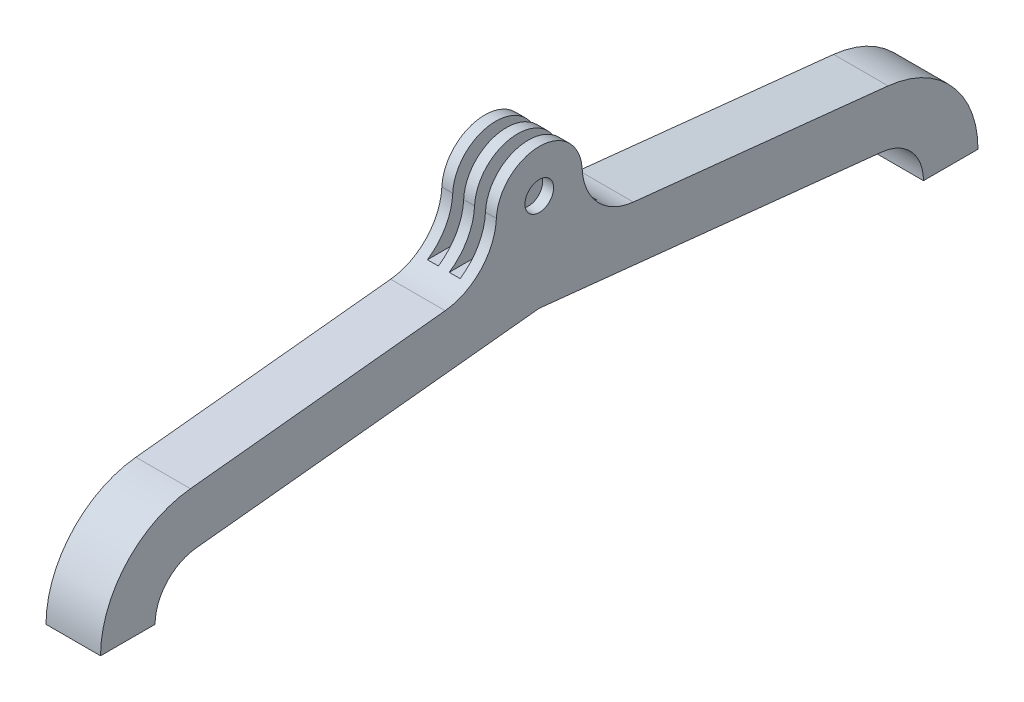
ISO-10303-21;
HEADER;
FILE_DESCRIPTION(('STEP AP214'),'2;1');
FILE_NAME('part.step','',(''),(''),'','','');
FILE_SCHEMA(('AUTOMOTIVE_DESIGN { 1 0 10303 214 1 1 1 1 }'));
ENDSEC;
DATA;
#1=APPLICATION_CONTEXT('core data for automotive mechanical design processes');
#2=APPLICATION_PROTOCOL_DEFINITION('international standard','automotive_design',2000,#1);
#3=PRODUCT_CONTEXT('',#1,'mechanical');
#4=PRODUCT('Part','Part','',(#3));
#5=PRODUCT_RELATED_PRODUCT_CATEGORY('part','',(#4));
#6=PRODUCT_DEFINITION_FORMATION('','',#4);
#7=PRODUCT_DEFINITION_CONTEXT('part definition',#1,'design');
#8=PRODUCT_DEFINITION('design','',#6,#7);
#9=PRODUCT_DEFINITION_SHAPE('','',#8);
#10=(LENGTH_UNIT() NAMED_UNIT(*) SI_UNIT(.MILLI.,.METRE.));
#11=(NAMED_UNIT(*) PLANE_ANGLE_UNIT() SI_UNIT($,.RADIAN.));
#12=(NAMED_UNIT(*) SI_UNIT($,.STERADIAN.) SOLID_ANGLE_UNIT());
#13=UNCERTAINTY_MEASURE_WITH_UNIT(LENGTH_MEASURE(1.E-05),#10,'distance_accuracy_value','');
#14=(GEOMETRIC_REPRESENTATION_CONTEXT(3) GLOBAL_UNCERTAINTY_ASSIGNED_CONTEXT((#13)) GLOBAL_UNIT_ASSIGNED_CONTEXT((#10,
#11,#12)) REPRESENTATION_CONTEXT('',''));
#15=CARTESIAN_POINT('',(0.,0.,0.));
#16=DIRECTION('',(0.,0.,1.));
#17=DIRECTION('',(1.,0.,0.));
#18=AXIS2_PLACEMENT_3D('',#15,#16,#17);
#19=CARTESIAN_POINT('',(-103.832838819891,125.,-287.5));
#20=DIRECTION('',(1.,0.,0.));
#21=DIRECTION('',(0.,0.,-1.));
#22=AXIS2_PLACEMENT_3D('',#19,#20,#21);
#23=CYLINDRICAL_SURFACE('',#22,9.99999999999998);
#24=CARTESIAN_POINT('',(3.81000000000001,125.,-287.5));
#25=DIRECTION('',(1.,0.,0.));
#26=DIRECTION('',(0.,0.,-1.));
#27=AXIS2_PLACEMENT_3D('',#24,#25,#26);
#28=CIRCLE('',#27,9.99999999999998);
#29=CARTESIAN_POINT('',(3.80999999999999,125.,-297.5));
#30=VERTEX_POINT('',#29);
#31=EDGE_CURVE('E235',#30,#30,#28,.F.);
#32=CARTESIAN_POINT('',(-3.80999999999999,125.,-287.5));
#33=DIRECTION('',(-1.,0.,0.));
#34=DIRECTION('',(0.,0.,1.));
#35=AXIS2_PLACEMENT_3D('',#32,#33,#34);
#36=CIRCLE('',#35,9.99999999999998);
#37=CARTESIAN_POINT('',(-3.80999999999999,125.,-297.5));
#38=VERTEX_POINT('',#37);
#39=EDGE_CURVE('E192',#38,#38,#36,.F.);
#40=CARTESIAN_POINT('',(3.80999999999999,125.,-297.5));
#41=CARTESIAN_POINT('',(3.73062499999999,125.,-297.5));
#42=CARTESIAN_POINT('',(3.65124999999999,125.,-297.5));
#43=CARTESIAN_POINT('',(3.49249999999999,125.,-297.5));
#44=CARTESIAN_POINT('',(3.41312499999999,125.,-297.5));
#45=CARTESIAN_POINT('',(3.25437499999999,125.,-297.5));
#46=CARTESIAN_POINT('',(3.17499999999999,125.,-297.5));
#47=CARTESIAN_POINT('',(3.01624999999999,125.,-297.5));
#48=CARTESIAN_POINT('',(2.936875,125.,-297.5));
#49=CARTESIAN_POINT('',(2.778125,125.,-297.5));
#50=CARTESIAN_POINT('',(2.69875,125.,-297.5));
#51=CARTESIAN_POINT('',(2.54,125.,-297.5));
#52=CARTESIAN_POINT('',(2.460625,125.,-297.5));
#53=CARTESIAN_POINT('',(2.301875,125.,-297.5));
#54=CARTESIAN_POINT('',(2.2225,125.,-297.5));
#55=CARTESIAN_POINT('',(2.06375,125.,-297.5));
#56=CARTESIAN_POINT('',(1.984375,125.,-297.5));
#57=CARTESIAN_POINT('',(1.825625,125.,-297.5));
#58=CARTESIAN_POINT('',(1.74625,125.,-297.5));
#59=CARTESIAN_POINT('',(1.5875,125.,-297.5));
#60=CARTESIAN_POINT('',(1.50812499999999,125.,-297.5));
#61=CARTESIAN_POINT('',(1.349375,125.,-297.5));
#62=CARTESIAN_POINT('',(1.27,125.,-297.5));
#63=CARTESIAN_POINT('',(1.11125,125.,-297.5));
#64=CARTESIAN_POINT('',(1.031875,125.,-297.5));
#65=CARTESIAN_POINT('',(0.873124999999998,125.,-297.5));
#66=CARTESIAN_POINT('',(0.793750000000001,125.,-297.5));
#67=CARTESIAN_POINT('',(0.635000000000001,125.,-297.5));
#68=CARTESIAN_POINT('',(0.555624999999999,125.,-297.5));
#69=CARTESIAN_POINT('',(0.396875,125.,-297.5));
#70=CARTESIAN_POINT('',(0.317500000000003,125.,-297.5));
#71=CARTESIAN_POINT('',(0.158750000000004,125.,-297.5));
#72=CARTESIAN_POINT('',(0.0793750000000019,125.,-297.5));
#73=CARTESIAN_POINT('',(-0.0793750000000019,125.,-297.5));
#74=CARTESIAN_POINT('',(-0.158750000000004,125.,-297.5));
#75=CARTESIAN_POINT('',(-0.317500000000003,125.,-297.5));
#76=CARTESIAN_POINT('',(-0.396875,125.,-297.5));
#77=CARTESIAN_POINT('',(-0.555624999999999,125.,-297.5));
#78=CARTESIAN_POINT('',(-0.635000000000001,125.,-297.5));
#79=CARTESIAN_POINT('',(-0.793750000000001,125.,-297.5));
#80=CARTESIAN_POINT('',(-0.873124999999998,125.,-297.5));
#81=CARTESIAN_POINT('',(-1.031875,125.,-297.5));
#82=CARTESIAN_POINT('',(-1.11125,125.,-297.5));
#83=CARTESIAN_POINT('',(-1.27,125.,-297.5));
#84=CARTESIAN_POINT('',(-1.349375,125.,-297.5));
#85=CARTESIAN_POINT('',(-1.50812499999999,125.,-297.5));
#86=CARTESIAN_POINT('',(-1.5875,125.,-297.5));
#87=CARTESIAN_POINT('',(-1.74625,125.,-297.5));
#88=CARTESIAN_POINT('',(-1.825625,125.,-297.5));
#89=CARTESIAN_POINT('',(-1.984375,125.,-297.5));
#90=CARTESIAN_POINT('',(-2.06375,125.,-297.5));
#91=CARTESIAN_POINT('',(-2.2225,125.,-297.5));
#92=CARTESIAN_POINT('',(-2.301875,125.,-297.5));
#93=CARTESIAN_POINT('',(-2.460625,125.,-297.5));
#94=CARTESIAN_POINT('',(-2.54,125.,-297.5));
#95=CARTESIAN_POINT('',(-2.69875,125.,-297.5));
#96=CARTESIAN_POINT('',(-2.778125,125.,-297.5));
#97=CARTESIAN_POINT('',(-2.936875,125.,-297.5));
#98=CARTESIAN_POINT('',(-3.01624999999999,125.,-297.5));
#99=CARTESIAN_POINT('',(-3.17499999999999,125.,-297.5));
#100=CARTESIAN_POINT('',(-3.25437499999999,125.,-297.5));
#101=CARTESIAN_POINT('',(-3.41312499999999,125.,-297.5));
#102=CARTESIAN_POINT('',(-3.49249999999999,125.,-297.5));
#103=CARTESIAN_POINT('',(-3.65124999999999,125.,-297.5));
#104=CARTESIAN_POINT('',(-3.73062499999999,125.,-297.5));
#105=CARTESIAN_POINT('',(-3.80999999999999,125.,-297.5));
#106=B_SPLINE_CURVE_WITH_KNOTS('',3,(#40,#41,#42,#43,#44,#45,#46,#47,#48,#49,#50,#51,#52,#53,
#54,#55,#56,#57,#58,#59,#60,#61,#62,#63,#64,#65,#66,#67,#68,#69,#70,#71,#72,#73,#74,#75,#76,#77,
#78,#79,#80,#81,#82,#83,#84,#85,#86,#87,#88,#89,#90,#91,#92,#93,#94,#95,#96,#97,#98,#99,#100,
#101,#102,#103,#104,#105),.UNSPECIFIED.,.F.,.F.,(4,2,2,2,2,2,2,2,2,2,2,2,2,2,2,2,2,2,2,2,2,2,2,
2,2,2,2,2,2,2,2,2,4),(0.,0.238125000000006,0.476249999999998,0.714375000000003,
0.952499999999995,1.190625,1.42874999999999,1.666875,1.90499999999999,2.143125,2.38125,
2.61937499999999,2.8575,3.09562499999999,3.33375,3.57187499999999,3.80999999999999,4.048125,
4.28624999999999,4.524375,4.76249999999999,5.00062499999999,5.23874999999999,5.47687499999999,
5.715,5.95312499999999,6.19125,6.42937499999999,6.66749999999999,6.90562499999998,
7.14374999999999,7.38187499999998,7.61999999999999),.UNSPECIFIED.);
#107=EDGE_CURVE('BSEAM38',#30,#38,#106,.T.);
#108=ORIENTED_EDGE('',*,*,#31,.F.);
#109=ORIENTED_EDGE('',*,*,#39,.F.);
#110=ORIENTED_EDGE('',*,*,#107,.T.);
#111=ORIENTED_EDGE('',*,*,#107,.F.);
#112=EDGE_LOOP('',(#108,#110,#109,#111));
#113=FACE_BOUND('',#112,.T.);
#114=ADVANCED_FACE('F38',(#113),#23,.F.);
#115=CARTESIAN_POINT('',(-103.832838819891,125.,-287.5));
#116=DIRECTION('',(1.,0.,0.));
#117=DIRECTION('',(0.,0.,-1.));
#118=AXIS2_PLACEMENT_3D('',#115,#116,#117);
#119=CYLINDRICAL_SURFACE('',#118,30.);
#120=DIRECTION('',(1.,0.,0.));
#121=VECTOR('',#120,1.);
#122=CARTESIAN_POINT('',(-103.832838819891,126.383586201256,-317.468077836653));
#123=LINE('',#122,#121);
#124=CARTESIAN_POINT('',(3.81000000000001,126.383586201256,-317.468077836653));
#125=VERTEX_POINT('',#124);
#126=CARTESIAN_POINT('',(-3.80999999999999,126.383586201256,-317.468077836653));
#127=VERTEX_POINT('',#126);
#128=EDGE_CURVE('E344',#125,#127,#123,.F.);
#129=ORIENTED_EDGE('',*,*,#128,.T.);
#130=CARTESIAN_POINT('',(-3.80999999999999,125.,-287.5));
#131=DIRECTION('',(-1.,0.,0.));
#132=DIRECTION('',(0.,0.,1.));
#133=AXIS2_PLACEMENT_3D('',#130,#131,#132);
#134=CIRCLE('',#133,30.);
#135=CARTESIAN_POINT('',(-3.80999999999999,126.383586201256,-257.531922163347));
#136=VERTEX_POINT('',#135);
#137=EDGE_CURVE('E187',#127,#136,#134,.F.);
#138=ORIENTED_EDGE('',*,*,#137,.T.);
#139=DIRECTION('',(1.,0.,0.));
#140=VECTOR('',#139,1.);
#141=CARTESIAN_POINT('',(-103.832838819891,126.383586201256,-257.531922163347));
#142=LINE('',#141,#140);
#143=CARTESIAN_POINT('',(3.81000000000001,126.383586201256,-257.531922163347));
#144=VERTEX_POINT('',#143);
#145=EDGE_CURVE('E339',#136,#144,#142,.T.);
#146=ORIENTED_EDGE('',*,*,#145,.T.);
#147=CARTESIAN_POINT('',(3.81000000000001,125.,-287.5));
#148=DIRECTION('',(1.,0.,0.));
#149=DIRECTION('',(0.,0.,-1.));
#150=AXIS2_PLACEMENT_3D('',#147,#148,#149);
#151=CIRCLE('',#150,30.);
#152=EDGE_CURVE('E230',#144,#125,#151,.F.);
#153=ORIENTED_EDGE('',*,*,#152,.T.);
#154=EDGE_LOOP('',(#129,#138,#146,#153));
#155=FACE_BOUND('',#154,.T.);
#156=ADVANCED_FACE('F437',(#155),#119,.T.);
#157=CARTESIAN_POINT('',(-11.43,125.,-287.5));
#158=DIRECTION('',(-1.,0.,0.));
#159=DIRECTION('',(0.,0.,1.));
#160=AXIS2_PLACEMENT_3D('',#157,#158,#159);
#161=CIRCLE('',#160,30.);
#162=CARTESIAN_POINT('',(-11.43,126.383586201256,-317.468077836653));
#163=VERTEX_POINT('',#162);
#164=CARTESIAN_POINT('',(-11.43,126.383586201256,-257.531922163347));
#165=VERTEX_POINT('',#164);
#166=EDGE_CURVE('E204',#163,#165,#161,.F.);
#167=ORIENTED_EDGE('',*,*,#166,.F.);
#168=CARTESIAN_POINT('',(-19.05,126.383586201256,-317.468077836653));
#169=VERTEX_POINT('',#168);
#170=EDGE_CURVE('E338',#163,#169,#123,.F.);
#171=ORIENTED_EDGE('',*,*,#170,.T.);
#172=CARTESIAN_POINT('',(-19.05,125.,-287.5));
#173=DIRECTION('',(1.,0.,0.));
#174=DIRECTION('',(0.,0.,-1.));
#175=AXIS2_PLACEMENT_3D('',#172,#173,#174);
#176=CIRCLE('',#175,30.);
#177=CARTESIAN_POINT('',(-19.05,126.383586201256,-257.531922163347));
#178=VERTEX_POINT('',#177);
#179=EDGE_CURVE('E242',#178,#169,#176,.F.);
#180=ORIENTED_EDGE('',*,*,#179,.F.);
#181=EDGE_CURVE('E335',#178,#165,#142,.T.);
#182=ORIENTED_EDGE('',*,*,#181,.T.);
#183=EDGE_LOOP('',(#167,#171,#180,#182));
#184=FACE_BOUND('',#183,.T.);
#185=ADVANCED_FACE('F368',(#184),#119,.T.);
#186=CARTESIAN_POINT('',(-103.832838819891,128.228367802931,-357.42551495219));
#187=DIRECTION('',(1.,0.,0.));
#188=DIRECTION('',(0.,0.,-1.));
#189=AXIS2_PLACEMENT_3D('',#186,#187,#188);
#190=CYLINDRICAL_SURFACE('',#189,40.);
#191=CARTESIAN_POINT('',(-3.80999999999999,128.228367802931,-357.42551495219));
#192=DIRECTION('',(-1.,0.,0.));
#193=DIRECTION('',(0.,0.,1.));
#194=AXIS2_PLACEMENT_3D('',#191,#192,#193);
#195=CIRCLE('',#194,40.);
#196=CARTESIAN_POINT('',(-3.80999999999999,95.0000000000001,-335.157251141262));
#197=VERTEX_POINT('',#196);
#198=EDGE_CURVE('E181',#127,#197,#195,.F.);
#199=ORIENTED_EDGE('',*,*,#198,.F.);
#200=ORIENTED_EDGE('',*,*,#128,.F.);
#201=CARTESIAN_POINT('',(3.81000000000001,128.228367802931,-357.42551495219));
#202=DIRECTION('',(1.,0.,0.));
#203=DIRECTION('',(0.,0.,-1.));
#204=AXIS2_PLACEMENT_3D('',#201,#202,#203);
#205=CIRCLE('',#204,40.);
#206=CARTESIAN_POINT('',(3.81000000000001,95.0000000000001,-335.157251141262));
#207=VERTEX_POINT('',#206);
#208=EDGE_CURVE('E232',#207,#125,#205,.F.);
#209=ORIENTED_EDGE('',*,*,#208,.F.);
#210=DIRECTION('',(1.,0.,0.));
#211=VECTOR('',#210,1.);
#212=CARTESIAN_POINT('',(-103.832838819891,95.0000000000001,-335.157251141262));
#213=LINE('',#212,#211);
#214=CARTESIAN_POINT('',(11.43,95.0000000000001,-335.157251141262));
#215=VERTEX_POINT('',#214);
#216=EDGE_CURVE('E220',#215,#207,#213,.F.);
#217=ORIENTED_EDGE('',*,*,#216,.F.);
#218=CARTESIAN_POINT('',(11.43,128.228367802931,-357.42551495219));
#219=DIRECTION('',(1.,0.,0.));
#220=DIRECTION('',(0.,0.,-1.));
#221=AXIS2_PLACEMENT_3D('',#218,#219,#220);
#222=CIRCLE('',#221,40.);
#223=CARTESIAN_POINT('',(11.43,126.383586201256,-317.468077836653));
#224=VERTEX_POINT('',#223);
#225=EDGE_CURVE('E224',#215,#224,#222,.F.);
#226=ORIENTED_EDGE('',*,*,#225,.T.);
#227=CARTESIAN_POINT('',(19.05,126.383586201256,-317.468077836653));
#228=VERTEX_POINT('',#227);
#229=EDGE_CURVE('E340',#228,#224,#123,.F.);
#230=ORIENTED_EDGE('',*,*,#229,.F.);
#231=CARTESIAN_POINT('',(19.05,128.228367802931,-357.42551495219));
#232=DIRECTION('',(-1.,0.,0.));
#233=DIRECTION('',(0.,0.,1.));
#234=AXIS2_PLACEMENT_3D('',#231,#232,#233);
#235=CIRCLE('',#234,40.);
#236=CARTESIAN_POINT('',(19.05,88.4473252064938,-353.245963547981));
#237=VERTEX_POINT('',#236);
#238=EDGE_CURVE('E346',#237,#228,#235,.T.);
#239=ORIENTED_EDGE('',*,*,#238,.F.);
#240=DIRECTION('',(1.,0.,0.));
#241=VECTOR('',#240,1.);
#242=CARTESIAN_POINT('',(-19.05,88.4473252064938,-353.245963547981));
#243=LINE('',#242,#241);
#244=CARTESIAN_POINT('',(-19.05,88.4473252064938,-353.245963547981));
#245=VERTEX_POINT('',#244);
#246=EDGE_CURVE('E331',#245,#237,#243,.T.);
#247=ORIENTED_EDGE('',*,*,#246,.F.);
#248=CARTESIAN_POINT('',(-19.05,128.228367802931,-357.42551495219));
#249=DIRECTION('',(1.,0.,0.));
#250=DIRECTION('',(0.,0.,-1.));
#251=AXIS2_PLACEMENT_3D('',#248,#249,#250);
#252=CIRCLE('',#251,40.);
#253=EDGE_CURVE('E348',#169,#245,#252,.T.);
#254=ORIENTED_EDGE('',*,*,#253,.F.);
#255=ORIENTED_EDGE('',*,*,#170,.F.);
#256=CARTESIAN_POINT('',(-11.43,128.228367802931,-357.42551495219));
#257=DIRECTION('',(-1.,0.,0.));
#258=DIRECTION('',(0.,0.,1.));
#259=AXIS2_PLACEMENT_3D('',#256,#257,#258);
#260=CIRCLE('',#259,40.);
#261=CARTESIAN_POINT('',(-11.43,95.0000000000001,-335.157251141262));
#262=VERTEX_POINT('',#261);
#263=EDGE_CURVE('E203',#163,#262,#260,.F.);
#264=ORIENTED_EDGE('',*,*,#263,.T.);
#265=DIRECTION('',(1.,0.,0.));
#266=VECTOR('',#265,1.);
#267=CARTESIAN_POINT('',(-103.832838819891,95.0000000000001,-335.157251141262));
#268=LINE('',#267,#266);
#269=EDGE_CURVE('E195',#197,#262,#268,.F.);
#270=ORIENTED_EDGE('',*,*,#269,.F.);
#271=EDGE_LOOP('',(#199,#200,#209,#217,#226,#230,#239,#247,#254,#255,#264,#270));
#272=FACE_BOUND('',#271,.T.);
#273=ADVANCED_FACE('F200',(#272),#190,.F.);
#274=CARTESIAN_POINT('',(-103.832838819891,128.228367802931,-217.57448504781));
#275=DIRECTION('',(1.,0.,0.));
#276=DIRECTION('',(0.,0.,-1.));
#277=AXIS2_PLACEMENT_3D('',#274,#275,#276);
#278=CYLINDRICAL_SURFACE('',#277,40.);
#279=CARTESIAN_POINT('',(-3.80999999999999,128.228367802931,-217.57448504781));
#280=DIRECTION('',(-1.,0.,0.));
#281=DIRECTION('',(0.,0.,1.));
#282=AXIS2_PLACEMENT_3D('',#279,#280,#281);
#283=CIRCLE('',#282,40.);
#284=CARTESIAN_POINT('',(-3.80999999999999,95.0000000000001,-239.842748858738));
#285=VERTEX_POINT('',#284);
#286=EDGE_CURVE('E12',#285,#136,#283,.F.);
#287=ORIENTED_EDGE('',*,*,#286,.F.);
#288=DIRECTION('',(1.,0.,0.));
#289=VECTOR('',#288,1.);
#290=CARTESIAN_POINT('',(-103.832838819891,95.0000000000001,-239.842748858738));
#291=LINE('',#290,#289);
#292=CARTESIAN_POINT('',(-11.43,95.0000000000001,-239.842748858738));
#293=VERTEX_POINT('',#292);
#294=EDGE_CURVE('E197',#293,#285,#291,.T.);
#295=ORIENTED_EDGE('',*,*,#294,.F.);
#296=CARTESIAN_POINT('',(-11.43,128.228367802931,-217.57448504781));
#297=DIRECTION('',(-1.,0.,0.));
#298=DIRECTION('',(0.,0.,1.));
#299=AXIS2_PLACEMENT_3D('',#296,#297,#298);
#300=CIRCLE('',#299,40.);
#301=EDGE_CURVE('E46',#293,#165,#300,.F.);
#302=ORIENTED_EDGE('',*,*,#301,.T.);
#303=ORIENTED_EDGE('',*,*,#181,.F.);
#304=CARTESIAN_POINT('',(-19.05,128.228367802931,-217.57448504781));
#305=DIRECTION('',(1.,0.,0.));
#306=DIRECTION('',(0.,0.,-1.));
#307=AXIS2_PLACEMENT_3D('',#304,#305,#306);
#308=CIRCLE('',#307,40.);
#309=CARTESIAN_POINT('',(-19.05,88.4473252064938,-221.754036452019));
#310=VERTEX_POINT('',#309);
#311=EDGE_CURVE('E352',#310,#178,#308,.T.);
#312=ORIENTED_EDGE('',*,*,#311,.F.);
#313=DIRECTION('',(-1.,0.,0.));
#314=VECTOR('',#313,1.);
#315=CARTESIAN_POINT('',(-19.05,88.4473252064938,-221.754036452019));
#316=LINE('',#315,#314);
#317=CARTESIAN_POINT('',(19.05,88.4473252064938,-221.754036452019));
#318=VERTEX_POINT('',#317);
#319=EDGE_CURVE('E343',#318,#310,#316,.T.);
#320=ORIENTED_EDGE('',*,*,#319,.F.);
#321=CARTESIAN_POINT('',(19.05,128.228367802931,-217.57448504781));
#322=DIRECTION('',(-1.,0.,0.));
#323=DIRECTION('',(0.,0.,1.));
#324=AXIS2_PLACEMENT_3D('',#321,#322,#323);
#325=CIRCLE('',#324,40.);
#326=CARTESIAN_POINT('',(19.05,126.383586201256,-257.531922163347));
#327=VERTEX_POINT('',#326);
#328=EDGE_CURVE('E350',#327,#318,#325,.T.);
#329=ORIENTED_EDGE('',*,*,#328,.F.);
#330=CARTESIAN_POINT('',(11.43,126.383586201256,-257.531922163347));
#331=VERTEX_POINT('',#330);
#332=EDGE_CURVE('E334',#331,#327,#142,.T.);
#333=ORIENTED_EDGE('',*,*,#332,.F.);
#334=CARTESIAN_POINT('',(11.43,128.228367802931,-217.57448504781));
#335=DIRECTION('',(1.,0.,0.));
#336=DIRECTION('',(0.,0.,-1.));
#337=AXIS2_PLACEMENT_3D('',#334,#335,#336);
#338=CIRCLE('',#337,40.);
#339=CARTESIAN_POINT('',(11.43,95.0000000000001,-239.842748858738));
#340=VERTEX_POINT('',#339);
#341=EDGE_CURVE('E356',#331,#340,#338,.F.);
#342=ORIENTED_EDGE('',*,*,#341,.T.);
#343=DIRECTION('',(1.,0.,0.));
#344=VECTOR('',#343,1.);
#345=CARTESIAN_POINT('',(-103.832838819891,95.0000000000001,-239.842748858738));
#346=LINE('',#345,#344);
#347=CARTESIAN_POINT('',(3.81000000000001,95.0000000000001,-239.842748858738));
#348=VERTEX_POINT('',#347);
#349=EDGE_CURVE('E354',#348,#340,#346,.T.);
#350=ORIENTED_EDGE('',*,*,#349,.F.);
#351=CARTESIAN_POINT('',(3.81000000000001,128.228367802931,-217.57448504781));
#352=DIRECTION('',(1.,0.,0.));
#353=DIRECTION('',(0.,0.,-1.));
#354=AXIS2_PLACEMENT_3D('',#351,#352,#353);
#355=CIRCLE('',#354,40.);
#356=EDGE_CURVE('E359',#144,#348,#355,.F.);
#357=ORIENTED_EDGE('',*,*,#356,.F.);
#358=ORIENTED_EDGE('',*,*,#145,.F.);
#359=EDGE_LOOP('',(#287,#295,#302,#303,#312,#320,#329,#333,#342,#350,#357,#358));
#360=FACE_BOUND('',#359,.T.);
#361=ADVANCED_FACE('F40',(#360),#278,.F.);
#362=CARTESIAN_POINT('',(-11.43,125.,-287.5));
#363=DIRECTION('',(-1.,0.,0.));
#364=DIRECTION('',(0.,0.,1.));
#365=AXIS2_PLACEMENT_3D('',#362,#363,#364);
#366=CIRCLE('',#365,9.99999999999998);
#367=CARTESIAN_POINT('',(-11.43,125.,-277.5));
#368=VERTEX_POINT('',#367);
#369=EDGE_CURVE('E210',#368,#368,#366,.F.);
#370=ORIENTED_EDGE('',*,*,#369,.T.);
#371=EDGE_LOOP('',(#370));
#372=FACE_BOUND('',#371,.T.);
#373=CARTESIAN_POINT('',(-19.05,125.,-287.5));
#374=DIRECTION('',(1.,0.,0.));
#375=DIRECTION('',(0.,0.,-1.));
#376=AXIS2_PLACEMENT_3D('',#373,#374,#375);
#377=CIRCLE('',#376,9.99999999999998);
#378=CARTESIAN_POINT('',(-19.05,125.,-297.5));
#379=VERTEX_POINT('',#378);
#380=EDGE_CURVE('E238',#379,#379,#377,.F.);
#381=ORIENTED_EDGE('',*,*,#380,.T.);
#382=EDGE_LOOP('',(#381));
#383=FACE_BOUND('',#382,.T.);
#384=ADVANCED_FACE('F446',(#372,#383),#23,.F.);
#385=CARTESIAN_POINT('',(11.43,125.,-287.5));
#386=DIRECTION('',(1.,0.,0.));
#387=DIRECTION('',(0.,0.,-1.));
#388=AXIS2_PLACEMENT_3D('',#385,#386,#387);
#389=CIRCLE('',#388,30.);
#390=EDGE_CURVE('E222',#331,#224,#389,.F.);
#391=ORIENTED_EDGE('',*,*,#390,.F.);
#392=ORIENTED_EDGE('',*,*,#332,.T.);
#393=CARTESIAN_POINT('',(19.05,125.,-287.5));
#394=DIRECTION('',(1.,0.,0.));
#395=DIRECTION('',(0.,0.,-1.));
#396=AXIS2_PLACEMENT_3D('',#393,#394,#395);
#397=CIRCLE('',#396,30.);
#398=EDGE_CURVE('E239',#228,#327,#397,.T.);
#399=ORIENTED_EDGE('',*,*,#398,.F.);
#400=ORIENTED_EDGE('',*,*,#229,.T.);
#401=EDGE_LOOP('',(#391,#392,#399,#400));
#402=FACE_BOUND('',#401,.T.);
#403=ADVANCED_FACE('F421',(#402),#119,.T.);
#404=CARTESIAN_POINT('',(0.,0.,-523.920393549917));
#405=DIRECTION('',(-1.,0.,0.));
#406=DIRECTION('',(0.,0.,1.));
#407=AXIS2_PLACEMENT_3D('',#404,#405,#406);
#408=CYLINDRICAL_SURFACE('',#407,32.0296064500826);
#409=DIRECTION('',(-1.,0.,0.));
#410=VECTOR('',#409,1.);
#411=CARTESIAN_POINT('',(-19.05,31.8542784634466,-527.267128215285));
#412=LINE('',#411,#410);
#413=CARTESIAN_POINT('',(19.05,31.8542784634466,-527.267128215285));
#414=VERTEX_POINT('',#413);
#415=CARTESIAN_POINT('',(-19.05,31.8542784634466,-527.267128215285));
#416=VERTEX_POINT('',#415);
#417=EDGE_CURVE('E251',#414,#416,#412,.T.);
#418=ORIENTED_EDGE('',*,*,#417,.T.);
#419=CARTESIAN_POINT('',(-19.05,0.,-523.920393549917));
#420=DIRECTION('',(-1.,0.,0.));
#421=DIRECTION('',(0.,0.,1.));
#422=AXIS2_PLACEMENT_3D('',#419,#420,#421);
#423=CIRCLE('',#422,32.0296064500826);
#424=CARTESIAN_POINT('',(-19.05,0.,-555.95));
#425=VERTEX_POINT('',#424);
#426=EDGE_CURVE('E322',#416,#425,#423,.T.);
#427=ORIENTED_EDGE('',*,*,#426,.T.);
#428=DIRECTION('',(-1.,0.,0.));
#429=VECTOR('',#428,1.);
#430=CARTESIAN_POINT('',(-19.05,0.,-555.95));
#431=LINE('',#430,#429);
#432=CARTESIAN_POINT('',(19.05,0.,-555.95));
#433=VERTEX_POINT('',#432);
#434=EDGE_CURVE('E313',#433,#425,#431,.T.);
#435=ORIENTED_EDGE('',*,*,#434,.F.);
#436=CARTESIAN_POINT('',(19.05,0.,-523.920393549917));
#437=DIRECTION('',(-1.,0.,0.));
#438=DIRECTION('',(0.,0.,1.));
#439=AXIS2_PLACEMENT_3D('',#436,#437,#438);
#440=CIRCLE('',#439,32.0296064500826);
#441=EDGE_CURVE('E325',#414,#433,#440,.T.);
#442=ORIENTED_EDGE('',*,*,#441,.F.);
#443=EDGE_LOOP('',(#418,#427,#435,#442));
#444=FACE_BOUND('',#443,.T.);
#445=ADVANCED_FACE('F391',(#444),#408,.F.);
#446=CARTESIAN_POINT('',(0.,0.,-523.920393549917));
#447=DIRECTION('',(-1.,0.,0.));
#448=DIRECTION('',(0.,0.,1.));
#449=AXIS2_PLACEMENT_3D('',#446,#447,#448);
#450=CYLINDRICAL_SURFACE('',#449,70.1296064500826);
#451=DIRECTION('',(1.,0.,0.));
#452=VECTOR('',#451,1.);
#453=CARTESIAN_POINT('',(-19.05,69.7457215365534,-531.248150927794));
#454=LINE('',#453,#452);
#455=CARTESIAN_POINT('',(-19.05,69.7457215365534,-531.248150927794));
#456=VERTEX_POINT('',#455);
#457=CARTESIAN_POINT('',(19.05,69.7457215365534,-531.248150927794));
#458=VERTEX_POINT('',#457);
#459=EDGE_CURVE('E254',#456,#458,#454,.T.);
#460=ORIENTED_EDGE('',*,*,#459,.T.);
#461=CARTESIAN_POINT('',(19.05,0.,-523.920393549917));
#462=DIRECTION('',(-1.,0.,0.));
#463=DIRECTION('',(0.,0.,1.));
#464=AXIS2_PLACEMENT_3D('',#461,#462,#463);
#465=CIRCLE('',#464,70.1296064500826);
#466=CARTESIAN_POINT('',(19.05,-1.11022302462516E-13,-594.05));
#467=VERTEX_POINT('',#466);
#468=EDGE_CURVE('E328',#458,#467,#465,.T.);
#469=ORIENTED_EDGE('',*,*,#468,.T.);
#470=DIRECTION('',(1.,0.,0.));
#471=VECTOR('',#470,1.);
#472=CARTESIAN_POINT('',(-19.05,-1.11022302462516E-13,-594.05));
#473=LINE('',#472,#471);
#474=CARTESIAN_POINT('',(-19.05,-1.11022302462516E-13,-594.05));
#475=VERTEX_POINT('',#474);
#476=EDGE_CURVE('E258',#475,#467,#473,.T.);
#477=ORIENTED_EDGE('',*,*,#476,.F.);
#478=CARTESIAN_POINT('',(-19.05,0.,-523.920393549917));
#479=DIRECTION('',(-1.,0.,0.));
#480=DIRECTION('',(0.,0.,1.));
#481=AXIS2_PLACEMENT_3D('',#478,#479,#480);
#482=CIRCLE('',#481,70.1296064500826);
#483=EDGE_CURVE('E319',#456,#475,#482,.T.);
#484=ORIENTED_EDGE('',*,*,#483,.F.);
#485=EDGE_LOOP('',(#460,#469,#477,#484));
#486=FACE_BOUND('',#485,.T.);
#487=ADVANCED_FACE('F387',(#486),#450,.T.);
#488=CARTESIAN_POINT('',(-19.05,95.354852418781,-287.5));
#489=DIRECTION('',(0.,-0.994526064910937,0.104488785105228));
#490=DIRECTION('',(0.,-0.104488785105228,-0.994526064910937));
#491=AXIS2_PLACEMENT_3D('',#488,#489,#490);
#492=PLANE('',#491);
#493=DIRECTION('',(0.,-0.104488785105228,-0.994526064910937));
#494=VECTOR('',#493,1.);
#495=CARTESIAN_POINT('',(-19.05,95.354852418781,-287.5));
#496=LINE('',#495,#494);
#497=EDGE_CURVE('E262',#245,#456,#496,.T.);
#498=ORIENTED_EDGE('',*,*,#497,.F.);
#499=ORIENTED_EDGE('',*,*,#246,.T.);
#500=DIRECTION('',(0.,-0.104488785105228,-0.994526064910937));
#501=VECTOR('',#500,1.);
#502=CARTESIAN_POINT('',(19.05,95.354852418781,-287.5));
#503=LINE('',#502,#501);
#504=EDGE_CURVE('E255',#237,#458,#503,.T.);
#505=ORIENTED_EDGE('',*,*,#504,.T.);
#506=ORIENTED_EDGE('',*,*,#459,.F.);
#507=EDGE_LOOP('',(#498,#499,#505,#506));
#508=FACE_BOUND('',#507,.T.);
#509=ADVANCED_FACE('F378',(#508),#492,.F.);
#510=CARTESIAN_POINT('',(-19.05,57.045147581219,-287.5));
#511=DIRECTION('',(0.,0.994526064910937,-0.104488785105228));
#512=DIRECTION('',(0.,0.104488785105228,0.994526064910937));
#513=AXIS2_PLACEMENT_3D('',#510,#511,#512);
#514=PLANE('',#513);
#515=ORIENTED_EDGE('',*,*,#417,.F.);
#516=DIRECTION('',(0.,-0.104488785105228,-0.994526064910937));
#517=VECTOR('',#516,1.);
#518=CARTESIAN_POINT('',(19.05,57.045147581219,-287.5));
#519=LINE('',#518,#517);
#520=CARTESIAN_POINT('',(19.05,57.045147581219,-287.5));
#521=VERTEX_POINT('',#520);
#522=EDGE_CURVE('E304',#521,#414,#519,.T.);
#523=ORIENTED_EDGE('',*,*,#522,.F.);
#524=DIRECTION('',(1.,0.,0.));
#525=VECTOR('',#524,1.);
#526=CARTESIAN_POINT('',(-19.05,57.045147581219,-287.5));
#527=LINE('',#526,#525);
#528=CARTESIAN_POINT('',(-19.05,57.045147581219,-287.5));
#529=VERTEX_POINT('',#528);
#530=EDGE_CURVE('E259',#529,#521,#527,.T.);
#531=ORIENTED_EDGE('',*,*,#530,.F.);
#532=DIRECTION('',(0.,-0.104488785105228,-0.994526064910937));
#533=VECTOR('',#532,1.);
#534=CARTESIAN_POINT('',(-19.05,57.045147581219,-287.5));
#535=LINE('',#534,#533);
#536=EDGE_CURVE('E301',#529,#416,#535,.T.);
#537=ORIENTED_EDGE('',*,*,#536,.T.);
#538=EDGE_LOOP('',(#515,#523,#531,#537));
#539=FACE_BOUND('',#538,.T.);
#540=ADVANCED_FACE('F395',(#539),#514,.F.);
#541=CARTESIAN_POINT('',(-19.05,31.8542784634466,-47.7328717847149));
#542=DIRECTION('',(0.,-0.994526064910937,-0.104488785105228));
#543=DIRECTION('',(0.,0.104488785105228,-0.994526064910937));
#544=AXIS2_PLACEMENT_3D('',#541,#542,#543);
#545=PLANE('',#544);
#546=DIRECTION('',(0.,0.104488785105228,-0.994526064910937));
#547=VECTOR('',#546,1.);
#548=CARTESIAN_POINT('',(-19.05,31.8542784634466,-47.7328717847149));
#549=LINE('',#548,#547);
#550=CARTESIAN_POINT('',(-19.05,31.8542784634466,-47.7328717847149));
#551=VERTEX_POINT('',#550);
#552=EDGE_CURVE('E289',#551,#529,#549,.T.);
#553=ORIENTED_EDGE('',*,*,#552,.T.);
#554=ORIENTED_EDGE('',*,*,#530,.T.);
#555=DIRECTION('',(0.,0.104488785105228,-0.994526064910937));
#556=VECTOR('',#555,1.);
#557=CARTESIAN_POINT('',(19.05,31.8542784634466,-47.7328717847149));
#558=LINE('',#557,#556);
#559=CARTESIAN_POINT('',(19.05,31.8542784634466,-47.7328717847149));
#560=VERTEX_POINT('',#559);
#561=EDGE_CURVE('E292',#560,#521,#558,.T.);
#562=ORIENTED_EDGE('',*,*,#561,.F.);
#563=DIRECTION('',(-1.,0.,0.));
#564=VECTOR('',#563,1.);
#565=CARTESIAN_POINT('',(-19.05,31.8542784634466,-47.7328717847149));
#566=LINE('',#565,#564);
#567=EDGE_CURVE('E278',#560,#551,#566,.T.);
#568=ORIENTED_EDGE('',*,*,#567,.T.);
#569=EDGE_LOOP('',(#553,#554,#562,#568));
#570=FACE_BOUND('',#569,.T.);
#571=ADVANCED_FACE('F399',(#570),#545,.T.);
#572=CARTESIAN_POINT('',(-19.05,69.7457215365533,-43.7518490722057));
#573=DIRECTION('',(0.,0.994526064910937,0.104488785105228));
#574=DIRECTION('',(0.,-0.104488785105228,0.994526064910937));
#575=AXIS2_PLACEMENT_3D('',#572,#573,#574);
#576=PLANE('',#575);
#577=DIRECTION('',(0.,0.104488785105228,-0.994526064910937));
#578=VECTOR('',#577,1.);
#579=CARTESIAN_POINT('',(19.05,69.7457215365533,-43.7518490722057));
#580=LINE('',#579,#578);
#581=CARTESIAN_POINT('',(19.05,69.7457215365533,-43.7518490722057));
#582=VERTEX_POINT('',#581);
#583=EDGE_CURVE('E295',#582,#318,#580,.T.);
#584=ORIENTED_EDGE('',*,*,#583,.T.);
#585=ORIENTED_EDGE('',*,*,#319,.T.);
#586=DIRECTION('',(0.,0.104488785105228,-0.994526064910937));
#587=VECTOR('',#586,1.);
#588=CARTESIAN_POINT('',(-19.05,69.7457215365533,-43.7518490722057));
#589=LINE('',#588,#587);
#590=CARTESIAN_POINT('',(-19.05,69.7457215365533,-43.7518490722057));
#591=VERTEX_POINT('',#590);
#592=EDGE_CURVE('E263',#591,#310,#589,.T.);
#593=ORIENTED_EDGE('',*,*,#592,.F.);
#594=DIRECTION('',(1.,0.,0.));
#595=VECTOR('',#594,1.);
#596=CARTESIAN_POINT('',(-19.05,69.7457215365533,-43.7518490722057));
#597=LINE('',#596,#595);
#598=EDGE_CURVE('E275',#591,#582,#597,.T.);
#599=ORIENTED_EDGE('',*,*,#598,.T.);
#600=EDGE_LOOP('',(#584,#585,#593,#599));
#601=FACE_BOUND('',#600,.T.);
#602=ADVANCED_FACE('F415',(#601),#576,.T.);
#603=CARTESIAN_POINT('',(-19.05,69.7457215365533,-43.7518490722057));
#604=DIRECTION('',(1.,0.,0.));
#605=DIRECTION('',(0.,0.,-1.));
#606=AXIS2_PLACEMENT_3D('',#603,#604,#605);
#607=PLANE('',#606);
#608=ORIENTED_EDGE('',*,*,#592,.T.);
#609=ORIENTED_EDGE('',*,*,#311,.T.);
#610=ORIENTED_EDGE('',*,*,#179,.T.);
#611=ORIENTED_EDGE('',*,*,#253,.T.);
#612=ORIENTED_EDGE('',*,*,#497,.T.);
#613=ORIENTED_EDGE('',*,*,#483,.T.);
#614=DIRECTION('',(0.,0.,-1.));
#615=VECTOR('',#614,1.);
#616=CARTESIAN_POINT('',(-19.05,0.,-568.581051837909));
#617=LINE('',#616,#615);
#618=EDGE_CURVE('E310',#425,#475,#617,.T.);
#619=ORIENTED_EDGE('',*,*,#618,.F.);
#620=ORIENTED_EDGE('',*,*,#426,.F.);
#621=ORIENTED_EDGE('',*,*,#536,.F.);
#622=ORIENTED_EDGE('',*,*,#552,.F.);
#623=CARTESIAN_POINT('',(-19.05,0.,-51.0796064500826));
#624=DIRECTION('',(1.,0.,0.));
#625=DIRECTION('',(0.,0.,-1.));
#626=AXIS2_PLACEMENT_3D('',#623,#624,#625);
#627=CIRCLE('',#626,32.0296064500826);
#628=CARTESIAN_POINT('',(-19.05,0.,-19.05));
#629=VERTEX_POINT('',#628);
#630=EDGE_CURVE('E287',#551,#629,#627,.T.);
#631=ORIENTED_EDGE('',*,*,#630,.T.);
#632=DIRECTION('',(0.,0.,1.));
#633=VECTOR('',#632,1.);
#634=CARTESIAN_POINT('',(-19.05,0.,19.05));
#635=LINE('',#634,#633);
#636=CARTESIAN_POINT('',(-19.05,0.,19.05));
#637=VERTEX_POINT('',#636);
#638=EDGE_CURVE('E250',#629,#637,#635,.T.);
#639=ORIENTED_EDGE('',*,*,#638,.T.);
#640=CARTESIAN_POINT('',(-19.05,0.,-51.0796064500826));
#641=DIRECTION('',(1.,0.,0.));
#642=DIRECTION('',(0.,0.,-1.));
#643=AXIS2_PLACEMENT_3D('',#640,#641,#642);
#644=CIRCLE('',#643,70.1296064500826);
#645=EDGE_CURVE('E281',#591,#637,#644,.T.);
#646=ORIENTED_EDGE('',*,*,#645,.F.);
#647=EDGE_LOOP('',(#608,#609,#610,#611,#612,#613,#619,#620,#621,#622,#631,#639,#646));
#648=FACE_BOUND('',#647,.T.);
#649=ORIENTED_EDGE('',*,*,#380,.F.);
#650=EDGE_LOOP('',(#649));
#651=FACE_BOUND('',#650,.T.);
#652=ADVANCED_FACE('F371',(#648,#651),#607,.F.);
#653=CARTESIAN_POINT('',(0.,0.,-51.0796064500826));
#654=DIRECTION('',(1.,0.,0.));
#655=DIRECTION('',(0.,0.,-1.));
#656=AXIS2_PLACEMENT_3D('',#653,#654,#655);
#657=CYLINDRICAL_SURFACE('',#656,32.0296064500826);
#658=CARTESIAN_POINT('',(19.05,0.,-51.0796064500826));
#659=DIRECTION('',(1.,0.,0.));
#660=DIRECTION('',(0.,0.,-1.));
#661=AXIS2_PLACEMENT_3D('',#658,#659,#660);
#662=CIRCLE('',#661,32.0296064500826);
#663=CARTESIAN_POINT('',(19.05,0.,-19.05));
#664=VERTEX_POINT('',#663);
#665=EDGE_CURVE('E285',#560,#664,#662,.T.);
#666=ORIENTED_EDGE('',*,*,#665,.T.);
#667=DIRECTION('',(-1.,0.,0.));
#668=VECTOR('',#667,1.);
#669=CARTESIAN_POINT('',(-19.05,0.,-19.05));
#670=LINE('',#669,#668);
#671=EDGE_CURVE('E272',#664,#629,#670,.T.);
#672=ORIENTED_EDGE('',*,*,#671,.T.);
#673=ORIENTED_EDGE('',*,*,#630,.F.);
#674=ORIENTED_EDGE('',*,*,#567,.F.);
#675=EDGE_LOOP('',(#666,#672,#673,#674));
#676=FACE_BOUND('',#675,.T.);
#677=ADVANCED_FACE('F402',(#676),#657,.F.);
#678=CARTESIAN_POINT('',(19.05,69.7457215365533,-43.7518490722057));
#679=DIRECTION('',(-1.,0.,0.));
#680=DIRECTION('',(0.,0.,1.));
#681=AXIS2_PLACEMENT_3D('',#678,#679,#680);
#682=PLANE('',#681);
#683=ORIENTED_EDGE('',*,*,#504,.F.);
#684=ORIENTED_EDGE('',*,*,#238,.T.);
#685=ORIENTED_EDGE('',*,*,#398,.T.);
#686=ORIENTED_EDGE('',*,*,#328,.T.);
#687=ORIENTED_EDGE('',*,*,#583,.F.);
#688=CARTESIAN_POINT('',(19.05,0.,-51.0796064500826));
#689=DIRECTION('',(1.,0.,0.));
#690=DIRECTION('',(0.,0.,-1.));
#691=AXIS2_PLACEMENT_3D('',#688,#689,#690);
#692=CIRCLE('',#691,70.1296064500826);
#693=CARTESIAN_POINT('',(19.05,0.,19.05));
#694=VERTEX_POINT('',#693);
#695=EDGE_CURVE('E283',#582,#694,#692,.T.);
#696=ORIENTED_EDGE('',*,*,#695,.T.);
#697=DIRECTION('',(0.,0.,-1.));
#698=VECTOR('',#697,1.);
#699=CARTESIAN_POINT('',(19.05,0.,19.05));
#700=LINE('',#699,#698);
#701=EDGE_CURVE('E269',#694,#664,#700,.T.);
#702=ORIENTED_EDGE('',*,*,#701,.T.);
#703=ORIENTED_EDGE('',*,*,#665,.F.);
#704=ORIENTED_EDGE('',*,*,#561,.T.);
#705=ORIENTED_EDGE('',*,*,#522,.T.);
#706=ORIENTED_EDGE('',*,*,#441,.T.);
#707=DIRECTION('',(0.,0.,1.));
#708=VECTOR('',#707,1.);
#709=CARTESIAN_POINT('',(19.05,0.,-568.581051837909));
#710=LINE('',#709,#708);
#711=EDGE_CURVE('E316',#467,#433,#710,.T.);
#712=ORIENTED_EDGE('',*,*,#711,.F.);
#713=ORIENTED_EDGE('',*,*,#468,.F.);
#714=EDGE_LOOP('',(#683,#684,#685,#686,#687,#696,#702,#703,#704,#705,#706,#712,#713));
#715=FACE_BOUND('',#714,.T.);
#716=CARTESIAN_POINT('',(19.05,125.,-287.5));
#717=DIRECTION('',(1.,0.,0.));
#718=DIRECTION('',(0.,0.,-1.));
#719=AXIS2_PLACEMENT_3D('',#716,#717,#718);
#720=CIRCLE('',#719,9.99999999999998);
#721=CARTESIAN_POINT('',(19.05,125.,-297.5));
#722=VERTEX_POINT('',#721);
#723=EDGE_CURVE('E243',#722,#722,#720,.T.);
#724=ORIENTED_EDGE('',*,*,#723,.F.);
#725=EDGE_LOOP('',(#724));
#726=FACE_BOUND('',#725,.T.);
#727=ADVANCED_FACE('F382',(#715,#726),#682,.F.);
#728=CARTESIAN_POINT('',(0.,0.,-51.0796064500826));
#729=DIRECTION('',(1.,0.,0.));
#730=DIRECTION('',(0.,0.,-1.));
#731=AXIS2_PLACEMENT_3D('',#728,#729,#730);
#732=CYLINDRICAL_SURFACE('',#731,70.1296064500826);
#733=ORIENTED_EDGE('',*,*,#598,.F.);
#734=ORIENTED_EDGE('',*,*,#645,.T.);
#735=DIRECTION('',(1.,0.,0.));
#736=VECTOR('',#735,1.);
#737=CARTESIAN_POINT('',(-19.05,0.,19.05));
#738=LINE('',#737,#736);
#739=EDGE_CURVE('E266',#637,#694,#738,.T.);
#740=ORIENTED_EDGE('',*,*,#739,.T.);
#741=ORIENTED_EDGE('',*,*,#695,.F.);
#742=EDGE_LOOP('',(#733,#734,#740,#741));
#743=FACE_BOUND('',#742,.T.);
#744=ADVANCED_FACE('F413',(#743),#732,.T.);
#745=CARTESIAN_POINT('',(0.,0.,0.));
#746=DIRECTION('',(0.,-1.,0.));
#747=DIRECTION('',(0.,0.,-1.));
#748=AXIS2_PLACEMENT_3D('',#745,#746,#747);
#749=PLANE('',#748);
#750=ORIENTED_EDGE('',*,*,#638,.F.);
#751=ORIENTED_EDGE('',*,*,#671,.F.);
#752=ORIENTED_EDGE('',*,*,#701,.F.);
#753=ORIENTED_EDGE('',*,*,#739,.F.);
#754=EDGE_LOOP('',(#750,#751,#752,#753));
#755=FACE_BOUND('',#754,.T.);
#756=ADVANCED_FACE('F408',(#755),#749,.T.);
#757=CARTESIAN_POINT('',(0.,-1.11022302462516E-13,-575.));
#758=DIRECTION('',(0.,-1.,0.));
#759=DIRECTION('',(0.,0.,-1.));
#760=AXIS2_PLACEMENT_3D('',#757,#758,#759);
#761=PLANE('',#760);
#762=ORIENTED_EDGE('',*,*,#476,.T.);
#763=ORIENTED_EDGE('',*,*,#711,.T.);
#764=ORIENTED_EDGE('',*,*,#434,.T.);
#765=ORIENTED_EDGE('',*,*,#618,.T.);
#766=EDGE_LOOP('',(#762,#763,#764,#765));
#767=FACE_BOUND('',#766,.T.);
#768=ADVANCED_FACE('F389',(#767),#761,.T.);
#769=CARTESIAN_POINT('',(11.43,125.,-287.5));
#770=DIRECTION('',(1.,0.,0.));
#771=DIRECTION('',(0.,0.,-1.));
#772=AXIS2_PLACEMENT_3D('',#769,#770,#771);
#773=CIRCLE('',#772,9.99999999999998);
#774=CARTESIAN_POINT('',(11.43,125.,-297.5));
#775=VERTEX_POINT('',#774);
#776=EDGE_CURVE('E227',#775,#775,#773,.F.);
#777=ORIENTED_EDGE('',*,*,#776,.T.);
#778=EDGE_LOOP('',(#777));
#779=FACE_BOUND('',#778,.T.);
#780=ORIENTED_EDGE('',*,*,#723,.T.);
#781=EDGE_LOOP('',(#780));
#782=FACE_BOUND('',#781,.T.);
#783=ADVANCED_FACE('F447',(#779,#782),#23,.F.);
#784=CARTESIAN_POINT('',(3.81000000000001,95.0000000000001,0.));
#785=DIRECTION('',(1.,0.,0.));
#786=DIRECTION('',(0.,0.,-1.));
#787=AXIS2_PLACEMENT_3D('',#784,#785,#786);
#788=PLANE('',#787);
#789=ORIENTED_EDGE('',*,*,#208,.T.);
#790=ORIENTED_EDGE('',*,*,#152,.F.);
#791=ORIENTED_EDGE('',*,*,#356,.T.);
#792=DIRECTION('',(0.,0.,-1.));
#793=VECTOR('',#792,1.);
#794=CARTESIAN_POINT('',(3.81000000000001,95.0000000000001,0.));
#795=LINE('',#794,#793);
#796=EDGE_CURVE('E61',#348,#207,#795,.T.);
#797=ORIENTED_EDGE('',*,*,#796,.T.);
#798=EDGE_LOOP('',(#789,#790,#791,#797));
#799=FACE_BOUND('',#798,.T.);
#800=ORIENTED_EDGE('',*,*,#31,.T.);
#801=EDGE_LOOP('',(#800));
#802=FACE_BOUND('',#801,.T.);
#803=ADVANCED_FACE('F434',(#799,#802),#788,.T.);
#804=CARTESIAN_POINT('',(11.43,95.0000000000001,0.));
#805=DIRECTION('',(1.,0.,0.));
#806=DIRECTION('',(0.,0.,-1.));
#807=AXIS2_PLACEMENT_3D('',#804,#805,#806);
#808=PLANE('',#807);
#809=DIRECTION('',(0.,0.,-1.));
#810=VECTOR('',#809,1.);
#811=CARTESIAN_POINT('',(11.43,95.0000000000001,0.));
#812=LINE('',#811,#810);
#813=EDGE_CURVE('E217',#340,#215,#812,.T.);
#814=ORIENTED_EDGE('',*,*,#813,.F.);
#815=ORIENTED_EDGE('',*,*,#341,.F.);
#816=ORIENTED_EDGE('',*,*,#390,.T.);
#817=ORIENTED_EDGE('',*,*,#225,.F.);
#818=EDGE_LOOP('',(#814,#815,#816,#817));
#819=FACE_BOUND('',#818,.T.);
#820=ORIENTED_EDGE('',*,*,#776,.F.);
#821=EDGE_LOOP('',(#820));
#822=FACE_BOUND('',#821,.T.);
#823=ADVANCED_FACE('F426',(#819,#822),#808,.F.);
#824=CARTESIAN_POINT('',(0.,95.0000000000001,0.));
#825=DIRECTION('',(0.,1.,0.));
#826=DIRECTION('',(0.,0.,1.));
#827=AXIS2_PLACEMENT_3D('',#824,#825,#826);
#828=PLANE('',#827);
#829=ORIENTED_EDGE('',*,*,#216,.T.);
#830=ORIENTED_EDGE('',*,*,#796,.F.);
#831=ORIENTED_EDGE('',*,*,#349,.T.);
#832=ORIENTED_EDGE('',*,*,#813,.T.);
#833=EDGE_LOOP('',(#829,#830,#831,#832));
#834=FACE_BOUND('',#833,.T.);
#835=ADVANCED_FACE('F428',(#834),#828,.T.);
#836=CARTESIAN_POINT('',(-3.80999999999999,95.0000000000001,0.));
#837=DIRECTION('',(-1.,0.,0.));
#838=DIRECTION('',(0.,0.,1.));
#839=AXIS2_PLACEMENT_3D('',#836,#837,#838);
#840=PLANE('',#839);
#841=ORIENTED_EDGE('',*,*,#198,.T.);
#842=DIRECTION('',(0.,0.,1.));
#843=VECTOR('',#842,1.);
#844=CARTESIAN_POINT('',(-3.80999999999999,95.0000000000001,0.));
#845=LINE('',#844,#843);
#846=EDGE_CURVE('E185',#197,#285,#845,.T.);
#847=ORIENTED_EDGE('',*,*,#846,.T.);
#848=ORIENTED_EDGE('',*,*,#286,.T.);
#849=ORIENTED_EDGE('',*,*,#137,.F.);
#850=EDGE_LOOP('',(#841,#847,#848,#849));
#851=FACE_BOUND('',#850,.T.);
#852=ORIENTED_EDGE('',*,*,#39,.T.);
#853=EDGE_LOOP('',(#852));
#854=FACE_BOUND('',#853,.T.);
#855=ADVANCED_FACE('F183',(#851,#854),#840,.T.);
#856=CARTESIAN_POINT('',(-11.43,95.0000000000001,0.));
#857=DIRECTION('',(-1.,0.,0.));
#858=DIRECTION('',(0.,0.,1.));
#859=AXIS2_PLACEMENT_3D('',#856,#857,#858);
#860=PLANE('',#859);
#861=ORIENTED_EDGE('',*,*,#263,.F.);
#862=ORIENTED_EDGE('',*,*,#166,.T.);
#863=ORIENTED_EDGE('',*,*,#301,.F.);
#864=DIRECTION('',(0.,0.,1.));
#865=VECTOR('',#864,1.);
#866=CARTESIAN_POINT('',(-11.43,95.0000000000001,0.));
#867=LINE('',#866,#865);
#868=EDGE_CURVE('E53',#262,#293,#867,.T.);
#869=ORIENTED_EDGE('',*,*,#868,.F.);
#870=EDGE_LOOP('',(#861,#862,#863,#869));
#871=FACE_BOUND('',#870,.T.);
#872=ORIENTED_EDGE('',*,*,#369,.F.);
#873=EDGE_LOOP('',(#872));
#874=FACE_BOUND('',#873,.T.);
#875=ADVANCED_FACE('F548',(#871,#874),#860,.F.);
#876=CARTESIAN_POINT('',(0.,95.0000000000001,0.));
#877=DIRECTION('',(0.,1.,0.));
#878=DIRECTION('',(0.,0.,1.));
#879=AXIS2_PLACEMENT_3D('',#876,#877,#878);
#880=PLANE('',#879);
#881=ORIENTED_EDGE('',*,*,#269,.T.);
#882=ORIENTED_EDGE('',*,*,#868,.T.);
#883=ORIENTED_EDGE('',*,*,#294,.T.);
#884=ORIENTED_EDGE('',*,*,#846,.F.);
#885=EDGE_LOOP('',(#881,#882,#883,#884));
#886=FACE_BOUND('',#885,.T.);
#887=ADVANCED_FACE('F194',(#886),#880,.T.);
#888=CLOSED_SHELL('',(#114,#156,#185,#273,#361,#384,#403,#445,#487,#509,#540,#571,#602,#652,
#677,#727,#744,#756,#768,#783,#803,#823,#835,#855,#875,#887));
#889=MANIFOLD_SOLID_BREP('B2',#888);
#890=ADVANCED_BREP_SHAPE_REPRESENTATION('',(#18,#889),#14);
#891=SHAPE_DEFINITION_REPRESENTATION(#9,#890);
ENDSEC;
END-ISO-10303-21;
